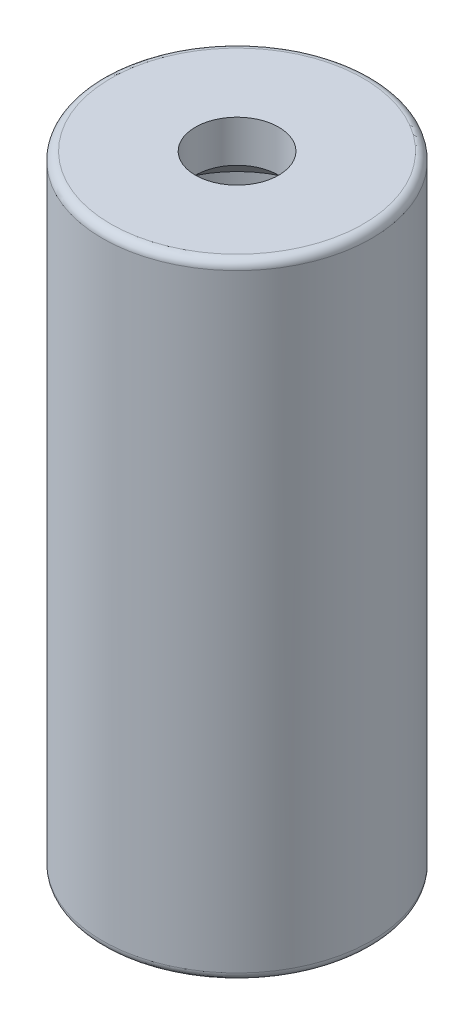
ISO-10303-21;
HEADER;
FILE_DESCRIPTION(('STEP AP214'),'2;1');
FILE_NAME('part.step','',(''),(''),'','','');
FILE_SCHEMA(('AUTOMOTIVE_DESIGN { 1 0 10303 214 1 1 1 1 }'));
ENDSEC;
DATA;
#1=APPLICATION_CONTEXT('core data for automotive mechanical design processes');
#2=APPLICATION_PROTOCOL_DEFINITION('international standard','automotive_design',2000,#1);
#3=PRODUCT_CONTEXT('',#1,'mechanical');
#4=PRODUCT('Part','Part','',(#3));
#5=PRODUCT_RELATED_PRODUCT_CATEGORY('part','',(#4));
#6=PRODUCT_DEFINITION_FORMATION('','',#4);
#7=PRODUCT_DEFINITION_CONTEXT('part definition',#1,'design');
#8=PRODUCT_DEFINITION('design','',#6,#7);
#9=PRODUCT_DEFINITION_SHAPE('','',#8);
#10=(LENGTH_UNIT() NAMED_UNIT(*) SI_UNIT(.MILLI.,.METRE.));
#11=(NAMED_UNIT(*) PLANE_ANGLE_UNIT() SI_UNIT($,.RADIAN.));
#12=(NAMED_UNIT(*) SI_UNIT($,.STERADIAN.) SOLID_ANGLE_UNIT());
#13=UNCERTAINTY_MEASURE_WITH_UNIT(LENGTH_MEASURE(1.E-05),#10,'distance_accuracy_value','');
#14=(GEOMETRIC_REPRESENTATION_CONTEXT(3) GLOBAL_UNCERTAINTY_ASSIGNED_CONTEXT((#13)) GLOBAL_UNIT_ASSIGNED_CONTEXT((#10,
#11,#12)) REPRESENTATION_CONTEXT('',''));
#15=CARTESIAN_POINT('',(0.,0.,0.));
#16=DIRECTION('',(0.,0.,1.));
#17=DIRECTION('',(1.,0.,0.));
#18=AXIS2_PLACEMENT_3D('',#15,#16,#17);
#19=CARTESIAN_POINT('',(0.,60.,0.));
#20=DIRECTION('',(0.,-1.,0.));
#21=DIRECTION('',(0.,0.,-1.));
#22=AXIS2_PLACEMENT_3D('',#19,#20,#21);
#23=CYLINDRICAL_SURFACE('',#22,16.15);
#24=CARTESIAN_POINT('',(0.,69.,0.));
#25=DIRECTION('',(0.,1.,0.));
#26=DIRECTION('',(0.,0.,1.));
#27=AXIS2_PLACEMENT_3D('',#24,#25,#26);
#28=CIRCLE('',#27,16.15);
#29=CARTESIAN_POINT('',(0.,69.,16.15));
#30=VERTEX_POINT('',#29);
#31=EDGE_CURVE('E38',#30,#30,#28,.F.);
#32=ORIENTED_EDGE('',*,*,#31,.T.);
#33=EDGE_LOOP('',(#32));
#34=FACE_BOUND('',#33,.T.);
#35=CARTESIAN_POINT('',(0.,-4.,0.));
#36=DIRECTION('',(0.,-1.,0.));
#37=DIRECTION('',(0.,0.,-1.));
#38=AXIS2_PLACEMENT_3D('',#35,#36,#37);
#39=CIRCLE('',#38,16.15);
#40=CARTESIAN_POINT('',(0.,-4.,-16.15));
#41=VERTEX_POINT('',#40);
#42=EDGE_CURVE('E42',#41,#41,#39,.F.);
#43=ORIENTED_EDGE('',*,*,#42,.T.);
#44=EDGE_LOOP('',(#43));
#45=FACE_BOUND('',#44,.T.);
#46=ADVANCED_FACE('F31',(#34,#45),#23,.T.);
#47=CARTESIAN_POINT('',(0.,-5.,0.));
#48=DIRECTION('',(0.,-1.,0.));
#49=DIRECTION('',(0.,0.,-1.));
#50=AXIS2_PLACEMENT_3D('',#47,#48,#49);
#51=PLANE('',#50);
#52=CARTESIAN_POINT('',(0.,-5.,0.));
#53=DIRECTION('',(0.,-1.,0.));
#54=DIRECTION('',(0.,0.,-1.));
#55=AXIS2_PLACEMENT_3D('',#52,#53,#54);
#56=CIRCLE('',#55,15.15);
#57=CARTESIAN_POINT('',(0.,-5.,-15.15));
#58=VERTEX_POINT('',#57);
#59=EDGE_CURVE('E10',#58,#58,#56,.T.);
#60=ORIENTED_EDGE('',*,*,#59,.T.);
#61=EDGE_LOOP('',(#60));
#62=FACE_BOUND('',#61,.T.);
#63=ADVANCED_FACE('F82',(#62),#51,.T.);
#64=CARTESIAN_POINT('',(0.,60.,0.));
#65=DIRECTION('',(0.,-1.,0.));
#66=DIRECTION('',(0.,0.,-1.));
#67=AXIS2_PLACEMENT_3D('',#64,#65,#66);
#68=CONICAL_SURFACE('',#67,11.15,0.888173774377681);
#69=CARTESIAN_POINT('',(0.,65.,0.));
#70=DIRECTION('',(0.,1.,0.));
#71=DIRECTION('',(0.,0.,1.));
#72=AXIS2_PLACEMENT_3D('',#69,#70,#71);
#73=CIRCLE('',#72,5.);
#74=CARTESIAN_POINT('',(0.,65.,5.));
#75=VERTEX_POINT('',#74);
#76=EDGE_CURVE('E57',#75,#75,#73,.T.);
#77=ORIENTED_EDGE('',*,*,#76,.T.);
#78=EDGE_LOOP('',(#77));
#79=FACE_BOUND('',#78,.T.);
#80=CARTESIAN_POINT('',(0.,60.,0.));
#81=DIRECTION('',(0.,1.,0.));
#82=DIRECTION('',(0.,0.,1.));
#83=AXIS2_PLACEMENT_3D('',#80,#81,#82);
#84=CIRCLE('',#83,11.15);
#85=CARTESIAN_POINT('',(0.,60.,11.15));
#86=VERTEX_POINT('',#85);
#87=EDGE_CURVE('E54',#86,#86,#84,.T.);
#88=ORIENTED_EDGE('',*,*,#87,.F.);
#89=EDGE_LOOP('',(#88));
#90=FACE_BOUND('',#89,.T.);
#91=ADVANCED_FACE('F79',(#79,#90),#68,.F.);
#92=CARTESIAN_POINT('',(0.,60.,0.));
#93=DIRECTION('',(0.,1.,0.));
#94=DIRECTION('',(0.,0.,1.));
#95=AXIS2_PLACEMENT_3D('',#92,#93,#94);
#96=CYLINDRICAL_SURFACE('',#95,5.);
#97=CARTESIAN_POINT('',(0.,70.,0.));
#98=DIRECTION('',(0.,1.,0.));
#99=DIRECTION('',(0.,0.,1.));
#100=AXIS2_PLACEMENT_3D('',#97,#98,#99);
#101=CIRCLE('',#100,5.);
#102=CARTESIAN_POINT('',(0.,70.,5.));
#103=VERTEX_POINT('',#102);
#104=EDGE_CURVE('E60',#103,#103,#101,.T.);
#105=ORIENTED_EDGE('',*,*,#104,.T.);
#106=EDGE_LOOP('',(#105));
#107=FACE_BOUND('',#106,.T.);
#108=ORIENTED_EDGE('',*,*,#76,.F.);
#109=EDGE_LOOP('',(#108));
#110=FACE_BOUND('',#109,.T.);
#111=ADVANCED_FACE('F64',(#107,#110),#96,.F.);
#112=CARTESIAN_POINT('',(-5.,70.,0.));
#113=DIRECTION('',(0.,1.,0.));
#114=DIRECTION('',(0.,0.,1.));
#115=AXIS2_PLACEMENT_3D('',#112,#113,#114);
#116=PLANE('',#115);
#117=CARTESIAN_POINT('',(0.,70.,0.));
#118=DIRECTION('',(0.,1.,0.));
#119=DIRECTION('',(0.,0.,1.));
#120=AXIS2_PLACEMENT_3D('',#117,#118,#119);
#121=CIRCLE('',#120,15.15);
#122=CARTESIAN_POINT('',(0.,70.,15.15));
#123=VERTEX_POINT('',#122);
#124=EDGE_CURVE('E46',#123,#123,#121,.T.);
#125=ORIENTED_EDGE('',*,*,#124,.T.);
#126=EDGE_LOOP('',(#125));
#127=FACE_BOUND('',#126,.T.);
#128=ORIENTED_EDGE('',*,*,#104,.F.);
#129=EDGE_LOOP('',(#128));
#130=FACE_BOUND('',#129,.T.);
#131=ADVANCED_FACE('F67',(#127,#130),#116,.T.);
#132=CARTESIAN_POINT('',(0.,0.,0.));
#133=DIRECTION('',(0.,-1.,0.));
#134=DIRECTION('',(0.,0.,-1.));
#135=AXIS2_PLACEMENT_3D('',#132,#133,#134);
#136=PLANE('',#135);
#137=CARTESIAN_POINT('',(0.,0.,0.));
#138=DIRECTION('',(0.,1.,0.));
#139=DIRECTION('',(0.,0.,1.));
#140=AXIS2_PLACEMENT_3D('',#137,#138,#139);
#141=CIRCLE('',#140,11.15);
#142=CARTESIAN_POINT('',(0.,0.,11.15));
#143=VERTEX_POINT('',#142);
#144=EDGE_CURVE('E51',#143,#143,#141,.T.);
#145=ORIENTED_EDGE('',*,*,#144,.T.);
#146=EDGE_LOOP('',(#145));
#147=FACE_BOUND('',#146,.T.);
#148=ADVANCED_FACE('F69',(#147),#136,.F.);
#149=CARTESIAN_POINT('',(0.,60.,0.));
#150=DIRECTION('',(0.,-1.,0.));
#151=DIRECTION('',(0.,0.,-1.));
#152=AXIS2_PLACEMENT_3D('',#149,#150,#151);
#153=CYLINDRICAL_SURFACE('',#152,11.15);
#154=ORIENTED_EDGE('',*,*,#87,.T.);
#155=EDGE_LOOP('',(#154));
#156=FACE_BOUND('',#155,.T.);
#157=ORIENTED_EDGE('',*,*,#144,.F.);
#158=EDGE_LOOP('',(#157));
#159=FACE_BOUND('',#158,.T.);
#160=ADVANCED_FACE('F76',(#156,#159),#153,.F.);
#161=CARTESIAN_POINT('',(0.,69.,0.));
#162=DIRECTION('',(0.,1.,0.));
#163=DIRECTION('',(0.,0.,1.));
#164=AXIS2_PLACEMENT_3D('',#161,#162,#163);
#165=TOROIDAL_SURFACE('',#164,15.15,1.);
#166=ORIENTED_EDGE('',*,*,#31,.F.);
#167=EDGE_LOOP('',(#166));
#168=FACE_BOUND('',#167,.T.);
#169=ORIENTED_EDGE('',*,*,#124,.F.);
#170=EDGE_LOOP('',(#169));
#171=FACE_BOUND('',#170,.T.);
#172=ADVANCED_FACE('F90',(#168,#171),#165,.T.);
#173=CARTESIAN_POINT('',(0.,-4.,0.));
#174=DIRECTION('',(0.,-1.,0.));
#175=DIRECTION('',(0.,0.,-1.));
#176=AXIS2_PLACEMENT_3D('',#173,#174,#175);
#177=TOROIDAL_SURFACE('',#176,15.15,1.);
#178=ORIENTED_EDGE('',*,*,#42,.F.);
#179=EDGE_LOOP('',(#178));
#180=FACE_BOUND('',#179,.T.);
#181=ORIENTED_EDGE('',*,*,#59,.F.);
#182=EDGE_LOOP('',(#181));
#183=FACE_BOUND('',#182,.T.);
#184=ADVANCED_FACE('F33',(#180,#183),#177,.T.);
#185=CLOSED_SHELL('',(#46,#63,#91,#111,#131,#148,#160,#172,#184));
#186=MANIFOLD_SOLID_BREP('B2',#185);
#187=ADVANCED_BREP_SHAPE_REPRESENTATION('',(#18,#186),#14);
#188=SHAPE_DEFINITION_REPRESENTATION(#9,#187);
ENDSEC;
END-ISO-10303-21;
